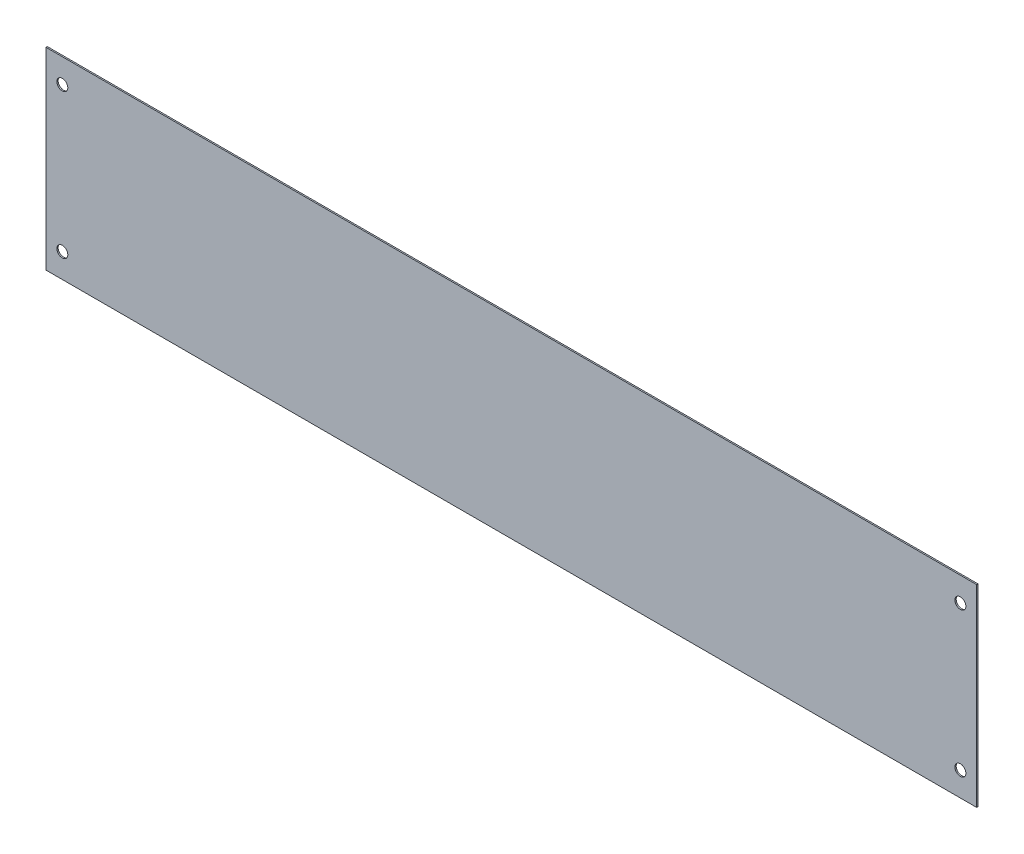
ISO-10303-21;
HEADER;
FILE_DESCRIPTION(('STEP AP214'),'2;1');
FILE_NAME('part.step','',(''),(''),'','','');
FILE_SCHEMA(('AUTOMOTIVE_DESIGN { 1 0 10303 214 1 1 1 1 }'));
ENDSEC;
DATA;
#1=APPLICATION_CONTEXT('core data for automotive mechanical design processes');
#2=APPLICATION_PROTOCOL_DEFINITION('international standard','automotive_design',2000,#1);
#3=PRODUCT_CONTEXT('',#1,'mechanical');
#4=PRODUCT('Part','Part','',(#3));
#5=PRODUCT_RELATED_PRODUCT_CATEGORY('part','',(#4));
#6=PRODUCT_DEFINITION_FORMATION('','',#4);
#7=PRODUCT_DEFINITION_CONTEXT('part definition',#1,'design');
#8=PRODUCT_DEFINITION('design','',#6,#7);
#9=PRODUCT_DEFINITION_SHAPE('','',#8);
#10=(LENGTH_UNIT() NAMED_UNIT(*) SI_UNIT(.MILLI.,.METRE.));
#11=(NAMED_UNIT(*) PLANE_ANGLE_UNIT() SI_UNIT($,.RADIAN.));
#12=(NAMED_UNIT(*) SI_UNIT($,.STERADIAN.) SOLID_ANGLE_UNIT());
#13=UNCERTAINTY_MEASURE_WITH_UNIT(LENGTH_MEASURE(1.E-05),#10,'distance_accuracy_value','');
#14=(GEOMETRIC_REPRESENTATION_CONTEXT(3) GLOBAL_UNCERTAINTY_ASSIGNED_CONTEXT((#13)) GLOBAL_UNIT_ASSIGNED_CONTEXT((#10,
#11,#12)) REPRESENTATION_CONTEXT('',''));
#15=CARTESIAN_POINT('',(0.,0.,0.));
#16=DIRECTION('',(0.,0.,1.));
#17=DIRECTION('',(1.,0.,0.));
#18=AXIS2_PLACEMENT_3D('',#15,#16,#17);
#19=CARTESIAN_POINT('',(453.55,0.,0.6));
#20=DIRECTION('',(1.,0.,0.));
#21=DIRECTION('',(0.,0.,-1.));
#22=AXIS2_PLACEMENT_3D('',#19,#20,#21);
#23=PLANE('',#22);
#24=DIRECTION('',(0.,-1.,0.));
#25=VECTOR('',#24,1.);
#26=CARTESIAN_POINT('',(453.55,0.,0.));
#27=LINE('',#26,#25);
#28=CARTESIAN_POINT('',(453.55,88.1,0.));
#29=VERTEX_POINT('',#28);
#30=CARTESIAN_POINT('',(453.55,0.,0.));
#31=VERTEX_POINT('',#30);
#32=EDGE_CURVE('E131',#29,#31,#27,.T.);
#33=ORIENTED_EDGE('',*,*,#32,.F.);
#34=DIRECTION('',(0.,0.,-1.));
#35=VECTOR('',#34,1.);
#36=CARTESIAN_POINT('',(453.55,88.1,0.6));
#37=LINE('',#36,#35);
#38=CARTESIAN_POINT('',(453.55,88.1,0.6));
#39=VERTEX_POINT('',#38);
#40=EDGE_CURVE('E11',#39,#29,#37,.T.);
#41=ORIENTED_EDGE('',*,*,#40,.F.);
#42=DIRECTION('',(0.,-1.,0.));
#43=VECTOR('',#42,1.);
#44=CARTESIAN_POINT('',(453.55,0.,0.6));
#45=LINE('',#44,#43);
#46=CARTESIAN_POINT('',(453.55,0.,0.6));
#47=VERTEX_POINT('',#46);
#48=EDGE_CURVE('E105',#39,#47,#45,.T.);
#49=ORIENTED_EDGE('',*,*,#48,.T.);
#50=DIRECTION('',(0.,0.,-1.));
#51=VECTOR('',#50,1.);
#52=CARTESIAN_POINT('',(453.55,0.,0.6));
#53=LINE('',#52,#51);
#54=EDGE_CURVE('E82',#47,#31,#53,.T.);
#55=ORIENTED_EDGE('',*,*,#54,.T.);
#56=EDGE_LOOP('',(#33,#41,#49,#55));
#57=FACE_BOUND('',#56,.T.);
#58=ADVANCED_FACE('F41',(#57),#23,.T.);
#59=CARTESIAN_POINT('',(0.,88.1,0.6));
#60=DIRECTION('',(0.,1.,0.));
#61=DIRECTION('',(-1.,0.,0.));
#62=AXIS2_PLACEMENT_3D('',#59,#60,#61);
#63=PLANE('',#62);
#64=DIRECTION('',(1.,0.,0.));
#65=VECTOR('',#64,1.);
#66=CARTESIAN_POINT('',(0.,88.1,0.));
#67=LINE('',#66,#65);
#68=CARTESIAN_POINT('',(28.65,88.1,0.));
#69=VERTEX_POINT('',#68);
#70=EDGE_CURVE('E94',#69,#29,#67,.T.);
#71=ORIENTED_EDGE('',*,*,#70,.F.);
#72=DIRECTION('',(0.,0.,-1.));
#73=VECTOR('',#72,1.);
#74=CARTESIAN_POINT('',(28.65,88.1,0.6));
#75=LINE('',#74,#73);
#76=CARTESIAN_POINT('',(28.65,88.1,0.6));
#77=VERTEX_POINT('',#76);
#78=EDGE_CURVE('E51',#77,#69,#75,.T.);
#79=ORIENTED_EDGE('',*,*,#78,.F.);
#80=DIRECTION('',(1.,0.,0.));
#81=VECTOR('',#80,1.);
#82=CARTESIAN_POINT('',(0.,88.1,0.6));
#83=LINE('',#82,#81);
#84=EDGE_CURVE('E92',#77,#39,#83,.T.);
#85=ORIENTED_EDGE('',*,*,#84,.T.);
#86=ORIENTED_EDGE('',*,*,#40,.T.);
#87=EDGE_LOOP('',(#71,#79,#85,#86));
#88=FACE_BOUND('',#87,.T.);
#89=ADVANCED_FACE('F90',(#88),#63,.T.);
#90=CARTESIAN_POINT('',(28.65,0.,0.6));
#91=DIRECTION('',(1.,0.,0.));
#92=DIRECTION('',(0.,1.,0.));
#93=AXIS2_PLACEMENT_3D('',#90,#91,#92);
#94=PLANE('',#93);
#95=DIRECTION('',(0.,-1.,0.));
#96=VECTOR('',#95,1.);
#97=CARTESIAN_POINT('',(28.65,0.,0.));
#98=LINE('',#97,#96);
#99=CARTESIAN_POINT('',(28.65,0.,0.));
#100=VERTEX_POINT('',#99);
#101=EDGE_CURVE('E136',#69,#100,#98,.T.);
#102=ORIENTED_EDGE('',*,*,#101,.T.);
#103=DIRECTION('',(0.,0.,-1.));
#104=VECTOR('',#103,1.);
#105=CARTESIAN_POINT('',(28.65,0.,0.6));
#106=LINE('',#105,#104);
#107=CARTESIAN_POINT('',(28.65,0.,0.6));
#108=VERTEX_POINT('',#107);
#109=EDGE_CURVE('E98',#108,#100,#106,.T.);
#110=ORIENTED_EDGE('',*,*,#109,.F.);
#111=DIRECTION('',(0.,-1.,0.));
#112=VECTOR('',#111,1.);
#113=CARTESIAN_POINT('',(28.65,0.,0.6));
#114=LINE('',#113,#112);
#115=EDGE_CURVE('E100',#77,#108,#114,.T.);
#116=ORIENTED_EDGE('',*,*,#115,.F.);
#117=ORIENTED_EDGE('',*,*,#78,.T.);
#118=EDGE_LOOP('',(#102,#110,#116,#117));
#119=FACE_BOUND('',#118,.T.);
#120=ADVANCED_FACE('F101',(#119),#94,.F.);
#121=CARTESIAN_POINT('',(36.1,77.05,0.6));
#122=DIRECTION('',(0.,0.,-1.));
#123=DIRECTION('',(-1.,0.,0.));
#124=AXIS2_PLACEMENT_3D('',#121,#122,#123);
#125=CYLINDRICAL_SURFACE('',#124,2.5);
#126=CARTESIAN_POINT('',(36.1,77.05,0.6));
#127=DIRECTION('',(0.,0.,1.));
#128=DIRECTION('',(1.,0.,0.));
#129=AXIS2_PLACEMENT_3D('',#126,#127,#128);
#130=CIRCLE('',#129,2.5);
#131=CARTESIAN_POINT('',(38.6,77.05,0.6));
#132=VERTEX_POINT('',#131);
#133=EDGE_CURVE('E109',#132,#132,#130,.T.);
#134=ORIENTED_EDGE('',*,*,#133,.T.);
#135=EDGE_LOOP('',(#134));
#136=FACE_BOUND('',#135,.T.);
#137=CARTESIAN_POINT('',(36.1,77.05,0.));
#138=DIRECTION('',(0.,0.,1.));
#139=DIRECTION('',(1.,0.,0.));
#140=AXIS2_PLACEMENT_3D('',#137,#138,#139);
#141=CIRCLE('',#140,2.5);
#142=CARTESIAN_POINT('',(38.6,77.05,0.));
#143=VERTEX_POINT('',#142);
#144=EDGE_CURVE('E127',#143,#143,#141,.T.);
#145=ORIENTED_EDGE('',*,*,#144,.F.);
#146=EDGE_LOOP('',(#145));
#147=FACE_BOUND('',#146,.T.);
#148=ADVANCED_FACE('F156',(#136,#147),#125,.F.);
#149=CARTESIAN_POINT('',(446.1,77.05,0.6));
#150=DIRECTION('',(0.,0.,-1.));
#151=DIRECTION('',(-1.,0.,0.));
#152=AXIS2_PLACEMENT_3D('',#149,#150,#151);
#153=CYLINDRICAL_SURFACE('',#152,2.50000000000002);
#154=CARTESIAN_POINT('',(446.1,77.05,0.6));
#155=DIRECTION('',(0.,0.,1.));
#156=DIRECTION('',(1.,0.,0.));
#157=AXIS2_PLACEMENT_3D('',#154,#155,#156);
#158=CIRCLE('',#157,2.50000000000002);
#159=CARTESIAN_POINT('',(448.6,77.05,0.6));
#160=VERTEX_POINT('',#159);
#161=EDGE_CURVE('E262',#160,#160,#158,.T.);
#162=ORIENTED_EDGE('',*,*,#161,.T.);
#163=EDGE_LOOP('',(#162));
#164=FACE_BOUND('',#163,.T.);
#165=CARTESIAN_POINT('',(446.1,77.05,0.));
#166=DIRECTION('',(0.,0.,1.));
#167=DIRECTION('',(1.,0.,0.));
#168=AXIS2_PLACEMENT_3D('',#165,#166,#167);
#169=CIRCLE('',#168,2.50000000000002);
#170=CARTESIAN_POINT('',(448.6,77.05,0.));
#171=VERTEX_POINT('',#170);
#172=EDGE_CURVE('E123',#171,#171,#169,.T.);
#173=ORIENTED_EDGE('',*,*,#172,.F.);
#174=EDGE_LOOP('',(#173));
#175=FACE_BOUND('',#174,.T.);
#176=ADVANCED_FACE('F159',(#164,#175),#153,.F.);
#177=CARTESIAN_POINT('',(446.1,11.05,0.6));
#178=DIRECTION('',(0.,0.,-1.));
#179=DIRECTION('',(-1.,0.,0.));
#180=AXIS2_PLACEMENT_3D('',#177,#178,#179);
#181=CYLINDRICAL_SURFACE('',#180,2.50000000000002);
#182=CARTESIAN_POINT('',(446.1,11.05,0.6));
#183=DIRECTION('',(0.,0.,1.));
#184=DIRECTION('',(1.,0.,0.));
#185=AXIS2_PLACEMENT_3D('',#182,#183,#184);
#186=CIRCLE('',#185,2.50000000000002);
#187=CARTESIAN_POINT('',(448.6,11.05,0.6));
#188=VERTEX_POINT('',#187);
#189=EDGE_CURVE('E173',#188,#188,#186,.T.);
#190=ORIENTED_EDGE('',*,*,#189,.T.);
#191=EDGE_LOOP('',(#190));
#192=FACE_BOUND('',#191,.T.);
#193=CARTESIAN_POINT('',(446.1,11.05,0.));
#194=DIRECTION('',(0.,0.,1.));
#195=DIRECTION('',(1.,0.,0.));
#196=AXIS2_PLACEMENT_3D('',#193,#194,#195);
#197=CIRCLE('',#196,2.50000000000002);
#198=CARTESIAN_POINT('',(448.6,11.05,0.));
#199=VERTEX_POINT('',#198);
#200=EDGE_CURVE('E119',#199,#199,#197,.T.);
#201=ORIENTED_EDGE('',*,*,#200,.F.);
#202=EDGE_LOOP('',(#201));
#203=FACE_BOUND('',#202,.T.);
#204=ADVANCED_FACE('F162',(#192,#203),#181,.F.);
#205=CARTESIAN_POINT('',(36.1,11.05,0.6));
#206=DIRECTION('',(0.,0.,-1.));
#207=DIRECTION('',(-1.,0.,0.));
#208=AXIS2_PLACEMENT_3D('',#205,#206,#207);
#209=CYLINDRICAL_SURFACE('',#208,2.5);
#210=CARTESIAN_POINT('',(36.1,11.05,0.6));
#211=DIRECTION('',(0.,0.,1.));
#212=DIRECTION('',(1.,0.,0.));
#213=AXIS2_PLACEMENT_3D('',#210,#211,#212);
#214=CIRCLE('',#213,2.5);
#215=CARTESIAN_POINT('',(38.6,11.05,0.6));
#216=VERTEX_POINT('',#215);
#217=EDGE_CURVE('E141',#216,#216,#214,.T.);
#218=ORIENTED_EDGE('',*,*,#217,.T.);
#219=EDGE_LOOP('',(#218));
#220=FACE_BOUND('',#219,.T.);
#221=CARTESIAN_POINT('',(36.1,11.05,0.));
#222=DIRECTION('',(0.,0.,1.));
#223=DIRECTION('',(1.,0.,0.));
#224=AXIS2_PLACEMENT_3D('',#221,#222,#223);
#225=CIRCLE('',#224,2.5);
#226=CARTESIAN_POINT('',(38.6,11.05,0.));
#227=VERTEX_POINT('',#226);
#228=EDGE_CURVE('E115',#227,#227,#225,.T.);
#229=ORIENTED_EDGE('',*,*,#228,.F.);
#230=EDGE_LOOP('',(#229));
#231=FACE_BOUND('',#230,.T.);
#232=ADVANCED_FACE('F43',(#220,#231),#209,.F.);
#233=CARTESIAN_POINT('',(0.,0.,0.6));
#234=DIRECTION('',(0.,1.,0.));
#235=DIRECTION('',(0.,0.,1.));
#236=AXIS2_PLACEMENT_3D('',#233,#234,#235);
#237=PLANE('',#236);
#238=DIRECTION('',(1.,0.,0.));
#239=VECTOR('',#238,1.);
#240=CARTESIAN_POINT('',(0.,0.,0.));
#241=LINE('',#240,#239);
#242=EDGE_CURVE('E75',#100,#31,#241,.T.);
#243=ORIENTED_EDGE('',*,*,#242,.T.);
#244=ORIENTED_EDGE('',*,*,#54,.F.);
#245=DIRECTION('',(1.,0.,0.));
#246=VECTOR('',#245,1.);
#247=CARTESIAN_POINT('',(0.,0.,0.6));
#248=LINE('',#247,#246);
#249=EDGE_CURVE('E59',#108,#47,#248,.T.);
#250=ORIENTED_EDGE('',*,*,#249,.F.);
#251=ORIENTED_EDGE('',*,*,#109,.T.);
#252=EDGE_LOOP('',(#243,#244,#250,#251));
#253=FACE_BOUND('',#252,.T.);
#254=ADVANCED_FACE('F146',(#253),#237,.F.);
#255=CARTESIAN_POINT('',(0.,0.,0.6));
#256=DIRECTION('',(0.,0.,1.));
#257=DIRECTION('',(1.,0.,0.));
#258=AXIS2_PLACEMENT_3D('',#255,#256,#257);
#259=PLANE('',#258);
#260=ORIENTED_EDGE('',*,*,#217,.F.);
#261=EDGE_LOOP('',(#260));
#262=FACE_BOUND('',#261,.T.);
#263=ORIENTED_EDGE('',*,*,#189,.F.);
#264=EDGE_LOOP('',(#263));
#265=FACE_BOUND('',#264,.T.);
#266=ORIENTED_EDGE('',*,*,#161,.F.);
#267=EDGE_LOOP('',(#266));
#268=FACE_BOUND('',#267,.T.);
#269=ORIENTED_EDGE('',*,*,#133,.F.);
#270=EDGE_LOOP('',(#269));
#271=FACE_BOUND('',#270,.T.);
#272=ORIENTED_EDGE('',*,*,#48,.F.);
#273=ORIENTED_EDGE('',*,*,#84,.F.);
#274=ORIENTED_EDGE('',*,*,#115,.T.);
#275=ORIENTED_EDGE('',*,*,#249,.T.);
#276=EDGE_LOOP('',(#272,#273,#274,#275));
#277=FACE_BOUND('',#276,.T.);
#278=ADVANCED_FACE('F104',(#262,#265,#268,#271,#277),#259,.T.);
#279=CARTESIAN_POINT('',(0.,0.,0.));
#280=DIRECTION('',(0.,0.,1.));
#281=DIRECTION('',(1.,0.,0.));
#282=AXIS2_PLACEMENT_3D('',#279,#280,#281);
#283=PLANE('',#282);
#284=ORIENTED_EDGE('',*,*,#228,.T.);
#285=EDGE_LOOP('',(#284));
#286=FACE_BOUND('',#285,.T.);
#287=ORIENTED_EDGE('',*,*,#200,.T.);
#288=EDGE_LOOP('',(#287));
#289=FACE_BOUND('',#288,.T.);
#290=ORIENTED_EDGE('',*,*,#172,.T.);
#291=EDGE_LOOP('',(#290));
#292=FACE_BOUND('',#291,.T.);
#293=ORIENTED_EDGE('',*,*,#144,.T.);
#294=EDGE_LOOP('',(#293));
#295=FACE_BOUND('',#294,.T.);
#296=ORIENTED_EDGE('',*,*,#32,.T.);
#297=ORIENTED_EDGE('',*,*,#242,.F.);
#298=ORIENTED_EDGE('',*,*,#101,.F.);
#299=ORIENTED_EDGE('',*,*,#70,.T.);
#300=EDGE_LOOP('',(#296,#297,#298,#299));
#301=FACE_BOUND('',#300,.T.);
#302=ADVANCED_FACE('F147',(#286,#289,#292,#295,#301),#283,.F.);
#303=CLOSED_SHELL('',(#58,#89,#120,#148,#176,#204,#232,#254,#278,#302));
#304=MANIFOLD_SOLID_BREP('B2',#303);
#305=ADVANCED_BREP_SHAPE_REPRESENTATION('',(#18,#304),#14);
#306=SHAPE_DEFINITION_REPRESENTATION(#9,#305);
ENDSEC;
END-ISO-10303-21;
